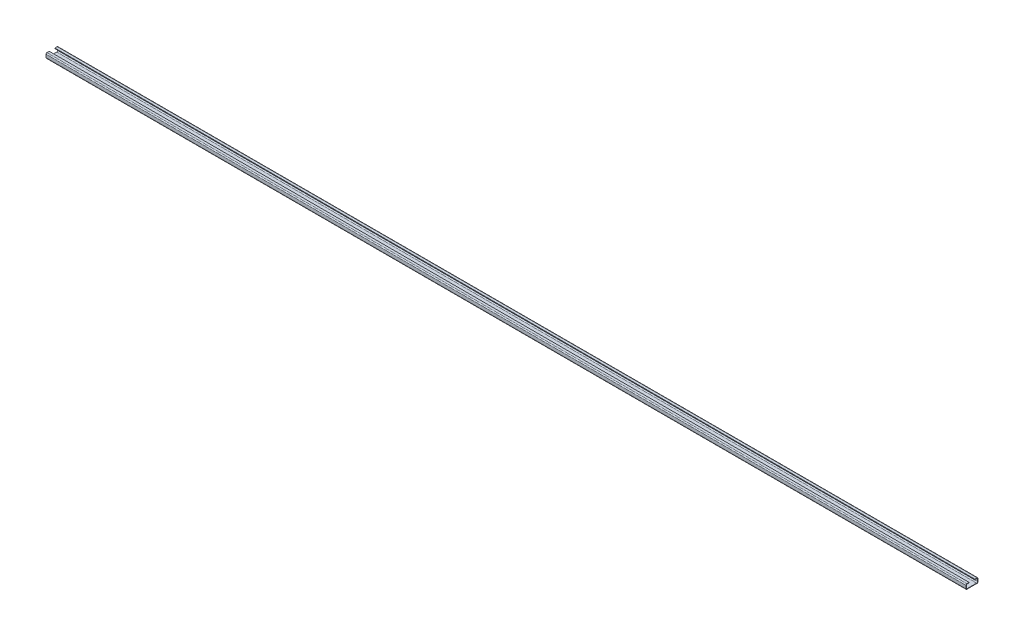
ISO-10303-21;
HEADER;
FILE_DESCRIPTION(('STEP AP214'),'2;1');
FILE_NAME('part.step','',(''),(''),'','','');
FILE_SCHEMA(('AUTOMOTIVE_DESIGN { 1 0 10303 214 1 1 1 1 }'));
ENDSEC;
DATA;
#1=APPLICATION_CONTEXT('core data for automotive mechanical design processes');
#2=APPLICATION_PROTOCOL_DEFINITION('international standard','automotive_design',2000,#1);
#3=PRODUCT_CONTEXT('',#1,'mechanical');
#4=PRODUCT('Part','Part','',(#3));
#5=PRODUCT_RELATED_PRODUCT_CATEGORY('part','',(#4));
#6=PRODUCT_DEFINITION_FORMATION('','',#4);
#7=PRODUCT_DEFINITION_CONTEXT('part definition',#1,'design');
#8=PRODUCT_DEFINITION('design','',#6,#7);
#9=PRODUCT_DEFINITION_SHAPE('','',#8);
#10=(LENGTH_UNIT() NAMED_UNIT(*) SI_UNIT(.MILLI.,.METRE.));
#11=(NAMED_UNIT(*) PLANE_ANGLE_UNIT() SI_UNIT($,.RADIAN.));
#12=(NAMED_UNIT(*) SI_UNIT($,.STERADIAN.) SOLID_ANGLE_UNIT());
#13=UNCERTAINTY_MEASURE_WITH_UNIT(LENGTH_MEASURE(1.E-05),#10,'distance_accuracy_value','');
#14=(GEOMETRIC_REPRESENTATION_CONTEXT(3) GLOBAL_UNCERTAINTY_ASSIGNED_CONTEXT((#13)) GLOBAL_UNIT_ASSIGNED_CONTEXT((#10,
#11,#12)) REPRESENTATION_CONTEXT('',''));
#15=CARTESIAN_POINT('',(0.,0.,0.));
#16=DIRECTION('',(0.,0.,1.));
#17=DIRECTION('',(1.,0.,0.));
#18=AXIS2_PLACEMENT_3D('',#15,#16,#17);
#19=CARTESIAN_POINT('',(5700.,15.,-37.5));
#20=DIRECTION('',(0.,0.,1.));
#21=DIRECTION('',(1.,0.,0.));
#22=AXIS2_PLACEMENT_3D('',#19,#20,#21);
#23=PLANE('',#22);
#24=DIRECTION('',(0.,1.,0.));
#25=VECTOR('',#24,1.);
#26=CARTESIAN_POINT('',(0.,15.,-37.5));
#27=LINE('',#26,#25);
#28=CARTESIAN_POINT('',(0.,-9.,-37.5));
#29=VERTEX_POINT('',#28);
#30=CARTESIAN_POINT('',(0.,9.,-37.5));
#31=VERTEX_POINT('',#30);
#32=EDGE_CURVE('E227',#29,#31,#27,.T.);
#33=ORIENTED_EDGE('',*,*,#32,.T.);
#34=DIRECTION('',(-1.,0.,0.));
#35=VECTOR('',#34,1.);
#36=CARTESIAN_POINT('',(5700.,9.,-37.5));
#37=LINE('',#36,#35);
#38=CARTESIAN_POINT('',(5700.,9.,-37.5));
#39=VERTEX_POINT('',#38);
#40=EDGE_CURVE('E303',#31,#39,#37,.F.);
#41=ORIENTED_EDGE('',*,*,#40,.T.);
#42=DIRECTION('',(0.,1.,0.));
#43=VECTOR('',#42,1.);
#44=CARTESIAN_POINT('',(5700.,15.,-37.5));
#45=LINE('',#44,#43);
#46=CARTESIAN_POINT('',(5700.,-9.,-37.5));
#47=VERTEX_POINT('',#46);
#48=EDGE_CURVE('E187',#47,#39,#45,.T.);
#49=ORIENTED_EDGE('',*,*,#48,.F.);
#50=DIRECTION('',(-1.,0.,0.));
#51=VECTOR('',#50,1.);
#52=CARTESIAN_POINT('',(5700.,-9.,-37.5));
#53=LINE('',#52,#51);
#54=EDGE_CURVE('E300',#47,#29,#53,.T.);
#55=ORIENTED_EDGE('',*,*,#54,.T.);
#56=EDGE_LOOP('',(#33,#41,#49,#55));
#57=FACE_BOUND('',#56,.T.);
#58=ADVANCED_FACE('F37',(#57),#23,.F.);
#59=CARTESIAN_POINT('',(5700.,15.,-17.5));
#60=DIRECTION('',(0.,-1.,0.));
#61=DIRECTION('',(0.,0.,-1.));
#62=AXIS2_PLACEMENT_3D('',#59,#60,#61);
#63=PLANE('',#62);
#64=DIRECTION('',(0.,0.,1.));
#65=VECTOR('',#64,1.);
#66=CARTESIAN_POINT('',(5700.,15.,-17.5));
#67=LINE('',#66,#65);
#68=CARTESIAN_POINT('',(5700.,15.,-31.5));
#69=VERTEX_POINT('',#68);
#70=CARTESIAN_POINT('',(5700.,15.,-17.5));
#71=VERTEX_POINT('',#70);
#72=EDGE_CURVE('E173',#69,#71,#67,.T.);
#73=ORIENTED_EDGE('',*,*,#72,.F.);
#74=DIRECTION('',(-1.,0.,0.));
#75=VECTOR('',#74,1.);
#76=CARTESIAN_POINT('',(5700.,15.,-31.5));
#77=LINE('',#76,#75);
#78=CARTESIAN_POINT('',(0.,15.,-31.5));
#79=VERTEX_POINT('',#78);
#80=EDGE_CURVE('E298',#69,#79,#77,.T.);
#81=ORIENTED_EDGE('',*,*,#80,.T.);
#82=DIRECTION('',(0.,0.,1.));
#83=VECTOR('',#82,1.);
#84=CARTESIAN_POINT('',(0.,15.,-17.5));
#85=LINE('',#84,#83);
#86=CARTESIAN_POINT('',(0.,15.,-17.5));
#87=VERTEX_POINT('',#86);
#88=EDGE_CURVE('E193',#79,#87,#85,.T.);
#89=ORIENTED_EDGE('',*,*,#88,.T.);
#90=DIRECTION('',(-1.,0.,0.));
#91=VECTOR('',#90,1.);
#92=CARTESIAN_POINT('',(5700.,15.,-17.5));
#93=LINE('',#92,#91);
#94=EDGE_CURVE('E190',#71,#87,#93,.T.);
#95=ORIENTED_EDGE('',*,*,#94,.F.);
#96=EDGE_LOOP('',(#73,#81,#89,#95));
#97=FACE_BOUND('',#96,.T.);
#98=ADVANCED_FACE('F191',(#97),#63,.F.);
#99=CARTESIAN_POINT('',(5700.,15.,-17.5));
#100=DIRECTION('',(0.,0.,-1.));
#101=DIRECTION('',(0.,1.,0.));
#102=AXIS2_PLACEMENT_3D('',#99,#100,#101);
#103=PLANE('',#102);
#104=DIRECTION('',(0.,-1.,0.));
#105=VECTOR('',#104,1.);
#106=CARTESIAN_POINT('',(0.,15.,-17.5));
#107=LINE('',#106,#105);
#108=CARTESIAN_POINT('',(0.,12.25,-17.5));
#109=VERTEX_POINT('',#108);
#110=EDGE_CURVE('E231',#87,#109,#107,.T.);
#111=ORIENTED_EDGE('',*,*,#110,.T.);
#112=DIRECTION('',(-1.,0.,0.));
#113=VECTOR('',#112,1.);
#114=CARTESIAN_POINT('',(5700.,12.25,-17.5));
#115=LINE('',#114,#113);
#116=CARTESIAN_POINT('',(5700.,12.25,-17.5));
#117=VERTEX_POINT('',#116);
#118=EDGE_CURVE('E197',#117,#109,#115,.T.);
#119=ORIENTED_EDGE('',*,*,#118,.F.);
#120=DIRECTION('',(0.,-1.,0.));
#121=VECTOR('',#120,1.);
#122=CARTESIAN_POINT('',(5700.,15.,-17.5));
#123=LINE('',#122,#121);
#124=EDGE_CURVE('E179',#71,#117,#123,.T.);
#125=ORIENTED_EDGE('',*,*,#124,.F.);
#126=ORIENTED_EDGE('',*,*,#94,.T.);
#127=EDGE_LOOP('',(#111,#119,#125,#126));
#128=FACE_BOUND('',#127,.T.);
#129=ADVANCED_FACE('F199',(#128),#103,.F.);
#130=CARTESIAN_POINT('',(5700.,12.25,-17.5));
#131=DIRECTION('',(0.,1.,0.));
#132=DIRECTION('',(0.,0.,1.));
#133=AXIS2_PLACEMENT_3D('',#130,#131,#132);
#134=PLANE('',#133);
#135=DIRECTION('',(0.,0.,-1.));
#136=VECTOR('',#135,1.);
#137=CARTESIAN_POINT('',(0.,12.25,-17.5));
#138=LINE('',#137,#136);
#139=CARTESIAN_POINT('',(0.,12.25,-28.75));
#140=VERTEX_POINT('',#139);
#141=EDGE_CURVE('E233',#109,#140,#138,.T.);
#142=ORIENTED_EDGE('',*,*,#141,.T.);
#143=DIRECTION('',(-1.,0.,0.));
#144=VECTOR('',#143,1.);
#145=CARTESIAN_POINT('',(5700.,12.25,-28.75));
#146=LINE('',#145,#144);
#147=CARTESIAN_POINT('',(5700.,12.25,-28.75));
#148=VERTEX_POINT('',#147);
#149=EDGE_CURVE('E267',#140,#148,#146,.F.);
#150=ORIENTED_EDGE('',*,*,#149,.T.);
#151=DIRECTION('',(0.,0.,-1.));
#152=VECTOR('',#151,1.);
#153=CARTESIAN_POINT('',(5700.,12.25,-17.5));
#154=LINE('',#153,#152);
#155=EDGE_CURVE('E202',#117,#148,#154,.T.);
#156=ORIENTED_EDGE('',*,*,#155,.F.);
#157=ORIENTED_EDGE('',*,*,#118,.T.);
#158=EDGE_LOOP('',(#142,#150,#156,#157));
#159=FACE_BOUND('',#158,.T.);
#160=ADVANCED_FACE('F462',(#159),#134,.F.);
#161=CARTESIAN_POINT('',(5700.,12.25,-34.75));
#162=DIRECTION('',(0.,0.,-1.));
#163=DIRECTION('',(0.,1.,0.));
#164=AXIS2_PLACEMENT_3D('',#161,#162,#163);
#165=PLANE('',#164);
#166=DIRECTION('',(0.,-1.,0.));
#167=VECTOR('',#166,1.);
#168=CARTESIAN_POINT('',(5700.,12.25,-34.75));
#169=LINE('',#168,#167);
#170=CARTESIAN_POINT('',(5700.,6.25,-34.75));
#171=VERTEX_POINT('',#170);
#172=CARTESIAN_POINT('',(5700.,-6.25,-34.75));
#173=VERTEX_POINT('',#172);
#174=EDGE_CURVE('E204',#171,#173,#169,.T.);
#175=ORIENTED_EDGE('',*,*,#174,.F.);
#176=DIRECTION('',(-1.,0.,0.));
#177=VECTOR('',#176,1.);
#178=CARTESIAN_POINT('',(0.,6.25,-34.75));
#179=LINE('',#178,#177);
#180=CARTESIAN_POINT('',(0.,6.25,-34.75));
#181=VERTEX_POINT('',#180);
#182=EDGE_CURVE('E264',#171,#181,#179,.T.);
#183=ORIENTED_EDGE('',*,*,#182,.T.);
#184=DIRECTION('',(0.,-1.,0.));
#185=VECTOR('',#184,1.);
#186=CARTESIAN_POINT('',(0.,12.25,-34.75));
#187=LINE('',#186,#185);
#188=CARTESIAN_POINT('',(0.,-6.25,-34.75));
#189=VERTEX_POINT('',#188);
#190=EDGE_CURVE('E236',#181,#189,#187,.T.);
#191=ORIENTED_EDGE('',*,*,#190,.T.);
#192=DIRECTION('',(-1.,0.,0.));
#193=VECTOR('',#192,1.);
#194=CARTESIAN_POINT('',(5700.,-6.25,-34.75));
#195=LINE('',#194,#193);
#196=EDGE_CURVE('E196',#189,#173,#195,.F.);
#197=ORIENTED_EDGE('',*,*,#196,.T.);
#198=EDGE_LOOP('',(#175,#183,#191,#197));
#199=FACE_BOUND('',#198,.T.);
#200=ADVANCED_FACE('F457',(#199),#165,.F.);
#201=CARTESIAN_POINT('',(5700.,-12.25,34.75));
#202=DIRECTION('',(0.,-1.,0.));
#203=DIRECTION('',(0.,0.,-1.));
#204=AXIS2_PLACEMENT_3D('',#201,#202,#203);
#205=PLANE('',#204);
#206=DIRECTION('',(0.,0.,1.));
#207=VECTOR('',#206,1.);
#208=CARTESIAN_POINT('',(5700.,-12.25,34.75));
#209=LINE('',#208,#207);
#210=CARTESIAN_POINT('',(5700.,-12.25,-28.75));
#211=VERTEX_POINT('',#210);
#212=CARTESIAN_POINT('',(5700.,-12.25,28.75));
#213=VERTEX_POINT('',#212);
#214=EDGE_CURVE('E210',#211,#213,#209,.T.);
#215=ORIENTED_EDGE('',*,*,#214,.F.);
#216=DIRECTION('',(-1.,0.,0.));
#217=VECTOR('',#216,1.);
#218=CARTESIAN_POINT('',(0.,-12.25,-28.75));
#219=LINE('',#218,#217);
#220=CARTESIAN_POINT('',(0.,-12.25,-28.75));
#221=VERTEX_POINT('',#220);
#222=EDGE_CURVE('E311',#211,#221,#219,.T.);
#223=ORIENTED_EDGE('',*,*,#222,.T.);
#224=DIRECTION('',(0.,0.,1.));
#225=VECTOR('',#224,1.);
#226=CARTESIAN_POINT('',(0.,-12.25,34.75));
#227=LINE('',#226,#225);
#228=CARTESIAN_POINT('',(0.,-12.25,28.75));
#229=VERTEX_POINT('',#228);
#230=EDGE_CURVE('E239',#221,#229,#227,.T.);
#231=ORIENTED_EDGE('',*,*,#230,.T.);
#232=DIRECTION('',(-1.,0.,0.));
#233=VECTOR('',#232,1.);
#234=CARTESIAN_POINT('',(5700.,-12.25,28.75));
#235=LINE('',#234,#233);
#236=EDGE_CURVE('E309',#229,#213,#235,.F.);
#237=ORIENTED_EDGE('',*,*,#236,.T.);
#238=EDGE_LOOP('',(#215,#223,#231,#237));
#239=FACE_BOUND('',#238,.T.);
#240=ADVANCED_FACE('F335',(#239),#205,.F.);
#241=CARTESIAN_POINT('',(5700.,12.25,34.75));
#242=DIRECTION('',(0.,0.,1.));
#243=DIRECTION('',(1.,0.,0.));
#244=AXIS2_PLACEMENT_3D('',#241,#242,#243);
#245=PLANE('',#244);
#246=DIRECTION('',(0.,1.,0.));
#247=VECTOR('',#246,1.);
#248=CARTESIAN_POINT('',(0.,12.25,34.75));
#249=LINE('',#248,#247);
#250=CARTESIAN_POINT('',(0.,-6.25,34.75));
#251=VERTEX_POINT('',#250);
#252=CARTESIAN_POINT('',(0.,6.25,34.75));
#253=VERTEX_POINT('',#252);
#254=EDGE_CURVE('E242',#251,#253,#249,.T.);
#255=ORIENTED_EDGE('',*,*,#254,.T.);
#256=DIRECTION('',(-1.,0.,0.));
#257=VECTOR('',#256,1.);
#258=CARTESIAN_POINT('',(5700.,6.25,34.75));
#259=LINE('',#258,#257);
#260=CARTESIAN_POINT('',(5700.,6.25,34.75));
#261=VERTEX_POINT('',#260);
#262=EDGE_CURVE('E275',#253,#261,#259,.F.);
#263=ORIENTED_EDGE('',*,*,#262,.T.);
#264=DIRECTION('',(0.,1.,0.));
#265=VECTOR('',#264,1.);
#266=CARTESIAN_POINT('',(5700.,12.25,34.75));
#267=LINE('',#266,#265);
#268=CARTESIAN_POINT('',(5700.,-6.25,34.75));
#269=VERTEX_POINT('',#268);
#270=EDGE_CURVE('E213',#269,#261,#267,.T.);
#271=ORIENTED_EDGE('',*,*,#270,.F.);
#272=DIRECTION('',(-1.,0.,0.));
#273=VECTOR('',#272,1.);
#274=CARTESIAN_POINT('',(0.,-6.25,34.75));
#275=LINE('',#274,#273);
#276=EDGE_CURVE('E272',#269,#251,#275,.T.);
#277=ORIENTED_EDGE('',*,*,#276,.T.);
#278=EDGE_LOOP('',(#255,#263,#271,#277));
#279=FACE_BOUND('',#278,.T.);
#280=ADVANCED_FACE('F342',(#279),#245,.F.);
#281=CARTESIAN_POINT('',(5700.,12.25,34.75));
#282=DIRECTION('',(0.,1.,0.));
#283=DIRECTION('',(0.,0.,1.));
#284=AXIS2_PLACEMENT_3D('',#281,#282,#283);
#285=PLANE('',#284);
#286=DIRECTION('',(0.,0.,-1.));
#287=VECTOR('',#286,1.);
#288=CARTESIAN_POINT('',(5700.,12.25,34.75));
#289=LINE('',#288,#287);
#290=CARTESIAN_POINT('',(5700.,12.25,28.75));
#291=VERTEX_POINT('',#290);
#292=CARTESIAN_POINT('',(5700.,12.25,17.5));
#293=VERTEX_POINT('',#292);
#294=EDGE_CURVE('E216',#291,#293,#289,.T.);
#295=ORIENTED_EDGE('',*,*,#294,.F.);
#296=DIRECTION('',(-1.,0.,0.));
#297=VECTOR('',#296,1.);
#298=CARTESIAN_POINT('',(0.,12.25,28.75));
#299=LINE('',#298,#297);
#300=CARTESIAN_POINT('',(0.,12.25,28.75));
#301=VERTEX_POINT('',#300);
#302=EDGE_CURVE('E269',#291,#301,#299,.T.);
#303=ORIENTED_EDGE('',*,*,#302,.T.);
#304=DIRECTION('',(0.,0.,-1.));
#305=VECTOR('',#304,1.);
#306=CARTESIAN_POINT('',(0.,12.25,34.75));
#307=LINE('',#306,#305);
#308=CARTESIAN_POINT('',(0.,12.25,17.5));
#309=VERTEX_POINT('',#308);
#310=EDGE_CURVE('E245',#301,#309,#307,.T.);
#311=ORIENTED_EDGE('',*,*,#310,.T.);
#312=DIRECTION('',(-1.,0.,0.));
#313=VECTOR('',#312,1.);
#314=CARTESIAN_POINT('',(5700.,12.25,17.5));
#315=LINE('',#314,#313);
#316=EDGE_CURVE('E259',#293,#309,#315,.T.);
#317=ORIENTED_EDGE('',*,*,#316,.F.);
#318=EDGE_LOOP('',(#295,#303,#311,#317));
#319=FACE_BOUND('',#318,.T.);
#320=ADVANCED_FACE('F350',(#319),#285,.F.);
#321=CARTESIAN_POINT('',(5700.,15.,17.5));
#322=DIRECTION('',(0.,0.,1.));
#323=DIRECTION('',(1.,0.,0.));
#324=AXIS2_PLACEMENT_3D('',#321,#322,#323);
#325=PLANE('',#324);
#326=DIRECTION('',(0.,1.,0.));
#327=VECTOR('',#326,1.);
#328=CARTESIAN_POINT('',(0.,15.,17.5));
#329=LINE('',#328,#327);
#330=CARTESIAN_POINT('',(0.,15.,17.5));
#331=VERTEX_POINT('',#330);
#332=EDGE_CURVE('E247',#309,#331,#329,.T.);
#333=ORIENTED_EDGE('',*,*,#332,.T.);
#334=DIRECTION('',(-1.,0.,0.));
#335=VECTOR('',#334,1.);
#336=CARTESIAN_POINT('',(5700.,15.,17.5));
#337=LINE('',#336,#335);
#338=CARTESIAN_POINT('',(5700.,15.,17.5));
#339=VERTEX_POINT('',#338);
#340=EDGE_CURVE('E226',#339,#331,#337,.T.);
#341=ORIENTED_EDGE('',*,*,#340,.F.);
#342=DIRECTION('',(0.,1.,0.));
#343=VECTOR('',#342,1.);
#344=CARTESIAN_POINT('',(5700.,15.,17.5));
#345=LINE('',#344,#343);
#346=EDGE_CURVE('E218',#293,#339,#345,.T.);
#347=ORIENTED_EDGE('',*,*,#346,.F.);
#348=ORIENTED_EDGE('',*,*,#316,.T.);
#349=EDGE_LOOP('',(#333,#341,#347,#348));
#350=FACE_BOUND('',#349,.T.);
#351=ADVANCED_FACE('F356',(#350),#325,.F.);
#352=CARTESIAN_POINT('',(5700.,15.,37.5));
#353=DIRECTION('',(0.,-1.,0.));
#354=DIRECTION('',(0.,0.,-1.));
#355=AXIS2_PLACEMENT_3D('',#352,#353,#354);
#356=PLANE('',#355);
#357=DIRECTION('',(0.,0.,1.));
#358=VECTOR('',#357,1.);
#359=CARTESIAN_POINT('',(0.,15.,37.5));
#360=LINE('',#359,#358);
#361=CARTESIAN_POINT('',(0.,15.,31.5));
#362=VERTEX_POINT('',#361);
#363=EDGE_CURVE('E249',#331,#362,#360,.T.);
#364=ORIENTED_EDGE('',*,*,#363,.T.);
#365=DIRECTION('',(-1.,0.,0.));
#366=VECTOR('',#365,1.);
#367=CARTESIAN_POINT('',(5700.,15.,31.5));
#368=LINE('',#367,#366);
#369=CARTESIAN_POINT('',(5700.,15.,31.5));
#370=VERTEX_POINT('',#369);
#371=EDGE_CURVE('E290',#362,#370,#368,.F.);
#372=ORIENTED_EDGE('',*,*,#371,.T.);
#373=DIRECTION('',(0.,0.,1.));
#374=VECTOR('',#373,1.);
#375=CARTESIAN_POINT('',(5700.,15.,37.5));
#376=LINE('',#375,#374);
#377=EDGE_CURVE('E220',#339,#370,#376,.T.);
#378=ORIENTED_EDGE('',*,*,#377,.F.);
#379=ORIENTED_EDGE('',*,*,#340,.T.);
#380=EDGE_LOOP('',(#364,#372,#378,#379));
#381=FACE_BOUND('',#380,.T.);
#382=ADVANCED_FACE('F479',(#381),#356,.F.);
#383=CARTESIAN_POINT('',(5700.,15.,37.5));
#384=DIRECTION('',(0.,0.,-1.));
#385=DIRECTION('',(0.,1.,0.));
#386=AXIS2_PLACEMENT_3D('',#383,#384,#385);
#387=PLANE('',#386);
#388=DIRECTION('',(0.,-1.,0.));
#389=VECTOR('',#388,1.);
#390=CARTESIAN_POINT('',(5700.,15.,37.5));
#391=LINE('',#390,#389);
#392=CARTESIAN_POINT('',(5700.,9.,37.5));
#393=VERTEX_POINT('',#392);
#394=CARTESIAN_POINT('',(5700.,-9.,37.5));
#395=VERTEX_POINT('',#394);
#396=EDGE_CURVE('E222',#393,#395,#391,.T.);
#397=ORIENTED_EDGE('',*,*,#396,.F.);
#398=DIRECTION('',(-1.,0.,0.));
#399=VECTOR('',#398,1.);
#400=CARTESIAN_POINT('',(5700.,9.,37.5));
#401=LINE('',#400,#399);
#402=CARTESIAN_POINT('',(0.,9.,37.5));
#403=VERTEX_POINT('',#402);
#404=EDGE_CURVE('E279',#393,#403,#401,.T.);
#405=ORIENTED_EDGE('',*,*,#404,.T.);
#406=DIRECTION('',(0.,-1.,0.));
#407=VECTOR('',#406,1.);
#408=CARTESIAN_POINT('',(0.,15.,37.5));
#409=LINE('',#408,#407);
#410=CARTESIAN_POINT('',(0.,-9.,37.5));
#411=VERTEX_POINT('',#410);
#412=EDGE_CURVE('E252',#403,#411,#409,.T.);
#413=ORIENTED_EDGE('',*,*,#412,.T.);
#414=DIRECTION('',(-1.,0.,0.));
#415=VECTOR('',#414,1.);
#416=CARTESIAN_POINT('',(5700.,-9.,37.5));
#417=LINE('',#416,#415);
#418=EDGE_CURVE('E277',#411,#395,#417,.F.);
#419=ORIENTED_EDGE('',*,*,#418,.T.);
#420=EDGE_LOOP('',(#397,#405,#413,#419));
#421=FACE_BOUND('',#420,.T.);
#422=ADVANCED_FACE('F366',(#421),#387,.F.);
#423=CARTESIAN_POINT('',(5700.,-15.,37.5));
#424=DIRECTION('',(0.,1.,0.));
#425=DIRECTION('',(0.,0.,1.));
#426=AXIS2_PLACEMENT_3D('',#423,#424,#425);
#427=PLANE('',#426);
#428=DIRECTION('',(0.,0.,-1.));
#429=VECTOR('',#428,1.);
#430=CARTESIAN_POINT('',(0.,-15.,37.5));
#431=LINE('',#430,#429);
#432=CARTESIAN_POINT('',(0.,-15.,31.5));
#433=VERTEX_POINT('',#432);
#434=CARTESIAN_POINT('',(0.,-15.,-31.5));
#435=VERTEX_POINT('',#434);
#436=EDGE_CURVE('E255',#433,#435,#431,.T.);
#437=ORIENTED_EDGE('',*,*,#436,.T.);
#438=DIRECTION('',(-1.,0.,0.));
#439=VECTOR('',#438,1.);
#440=CARTESIAN_POINT('',(5700.,-15.,-31.5));
#441=LINE('',#440,#439);
#442=CARTESIAN_POINT('',(5700.,-15.,-31.5));
#443=VERTEX_POINT('',#442);
#444=EDGE_CURVE('E52',#435,#443,#441,.F.);
#445=ORIENTED_EDGE('',*,*,#444,.T.);
#446=DIRECTION('',(0.,0.,-1.));
#447=VECTOR('',#446,1.);
#448=CARTESIAN_POINT('',(5700.,-15.,37.5));
#449=LINE('',#448,#447);
#450=CARTESIAN_POINT('',(5700.,-15.,31.5));
#451=VERTEX_POINT('',#450);
#452=EDGE_CURVE('E224',#451,#443,#449,.T.);
#453=ORIENTED_EDGE('',*,*,#452,.F.);
#454=DIRECTION('',(-1.,0.,0.));
#455=VECTOR('',#454,1.);
#456=CARTESIAN_POINT('',(5700.,-15.,31.5));
#457=LINE('',#456,#455);
#458=EDGE_CURVE('E305',#451,#433,#457,.T.);
#459=ORIENTED_EDGE('',*,*,#458,.T.);
#460=EDGE_LOOP('',(#437,#445,#453,#459));
#461=FACE_BOUND('',#460,.T.);
#462=ADVANCED_FACE('F372',(#461),#427,.F.);
#463=CARTESIAN_POINT('',(5700.,0.,0.));
#464=DIRECTION('',(1.,0.,0.));
#465=DIRECTION('',(0.,0.,-1.));
#466=AXIS2_PLACEMENT_3D('',#463,#464,#465);
#467=PLANE('',#466);
#468=ORIENTED_EDGE('',*,*,#377,.T.);
#469=CARTESIAN_POINT('',(5700.,9.,31.5));
#470=DIRECTION('',(1.,0.,0.));
#471=DIRECTION('',(0.,0.,-1.));
#472=AXIS2_PLACEMENT_3D('',#469,#470,#471);
#473=CIRCLE('',#472,6.);
#474=EDGE_CURVE('E296',#370,#393,#473,.T.);
#475=ORIENTED_EDGE('',*,*,#474,.T.);
#476=ORIENTED_EDGE('',*,*,#396,.T.);
#477=CARTESIAN_POINT('',(5700.,-9.,31.5));
#478=DIRECTION('',(1.,0.,0.));
#479=DIRECTION('',(0.,0.,-1.));
#480=AXIS2_PLACEMENT_3D('',#477,#478,#479);
#481=CIRCLE('',#480,6.);
#482=EDGE_CURVE('E59',#395,#451,#481,.T.);
#483=ORIENTED_EDGE('',*,*,#482,.T.);
#484=ORIENTED_EDGE('',*,*,#452,.T.);
#485=CARTESIAN_POINT('',(5700.,-9.,-31.5));
#486=DIRECTION('',(1.,0.,0.));
#487=DIRECTION('',(0.,0.,-1.));
#488=AXIS2_PLACEMENT_3D('',#485,#486,#487);
#489=CIRCLE('',#488,6.);
#490=EDGE_CURVE('E293',#443,#47,#489,.T.);
#491=ORIENTED_EDGE('',*,*,#490,.T.);
#492=ORIENTED_EDGE('',*,*,#48,.T.);
#493=CARTESIAN_POINT('',(5700.,9.,-31.5));
#494=DIRECTION('',(1.,0.,0.));
#495=DIRECTION('',(0.,0.,-1.));
#496=AXIS2_PLACEMENT_3D('',#493,#494,#495);
#497=CIRCLE('',#496,6.);
#498=EDGE_CURVE('E183',#39,#69,#497,.T.);
#499=ORIENTED_EDGE('',*,*,#498,.T.);
#500=ORIENTED_EDGE('',*,*,#72,.T.);
#501=ORIENTED_EDGE('',*,*,#124,.T.);
#502=ORIENTED_EDGE('',*,*,#155,.T.);
#503=CARTESIAN_POINT('',(5700.,6.25,-28.75));
#504=DIRECTION('',(1.,0.,0.));
#505=DIRECTION('',(0.,0.,-1.));
#506=AXIS2_PLACEMENT_3D('',#503,#504,#505);
#507=CIRCLE('',#506,6.);
#508=EDGE_CURVE('E316',#148,#171,#507,.F.);
#509=ORIENTED_EDGE('',*,*,#508,.T.);
#510=ORIENTED_EDGE('',*,*,#174,.T.);
#511=CARTESIAN_POINT('',(5700.,-6.25,-28.75));
#512=DIRECTION('',(1.,0.,0.));
#513=DIRECTION('',(0.,0.,-1.));
#514=AXIS2_PLACEMENT_3D('',#511,#512,#513);
#515=CIRCLE('',#514,6.);
#516=EDGE_CURVE('E324',#173,#211,#515,.F.);
#517=ORIENTED_EDGE('',*,*,#516,.T.);
#518=ORIENTED_EDGE('',*,*,#214,.T.);
#519=CARTESIAN_POINT('',(5700.,-6.25,28.75));
#520=DIRECTION('',(1.,0.,0.));
#521=DIRECTION('',(0.,0.,-1.));
#522=AXIS2_PLACEMENT_3D('',#519,#520,#521);
#523=CIRCLE('',#522,6.);
#524=EDGE_CURVE('E11',#213,#269,#523,.F.);
#525=ORIENTED_EDGE('',*,*,#524,.T.);
#526=ORIENTED_EDGE('',*,*,#270,.T.);
#527=CARTESIAN_POINT('',(5700.,6.25,28.75));
#528=DIRECTION('',(1.,0.,0.));
#529=DIRECTION('',(0.,0.,-1.));
#530=AXIS2_PLACEMENT_3D('',#527,#528,#529);
#531=CIRCLE('',#530,6.);
#532=EDGE_CURVE('E320',#261,#291,#531,.F.);
#533=ORIENTED_EDGE('',*,*,#532,.T.);
#534=ORIENTED_EDGE('',*,*,#294,.T.);
#535=ORIENTED_EDGE('',*,*,#346,.T.);
#536=EDGE_LOOP('',(#468,#475,#476,#483,#484,#491,#492,#499,#500,#501,#502,#509,#510,#517,#518,
#525,#526,#533,#534,#535));
#537=FACE_BOUND('',#536,.T.);
#538=ADVANCED_FACE('F176',(#537),#467,.T.);
#539=CARTESIAN_POINT('',(0.,0.,0.));
#540=DIRECTION('',(1.,0.,0.));
#541=DIRECTION('',(0.,0.,-1.));
#542=AXIS2_PLACEMENT_3D('',#539,#540,#541);
#543=PLANE('',#542);
#544=ORIENTED_EDGE('',*,*,#412,.F.);
#545=CARTESIAN_POINT('',(0.,9.,31.5));
#546=DIRECTION('',(1.,0.,0.));
#547=DIRECTION('',(0.,0.,-1.));
#548=AXIS2_PLACEMENT_3D('',#545,#546,#547);
#549=CIRCLE('',#548,6.);
#550=EDGE_CURVE('E288',#403,#362,#549,.F.);
#551=ORIENTED_EDGE('',*,*,#550,.T.);
#552=ORIENTED_EDGE('',*,*,#363,.F.);
#553=ORIENTED_EDGE('',*,*,#332,.F.);
#554=ORIENTED_EDGE('',*,*,#310,.F.);
#555=CARTESIAN_POINT('',(0.,6.25,28.75));
#556=DIRECTION('',(1.,0.,0.));
#557=DIRECTION('',(0.,0.,-1.));
#558=AXIS2_PLACEMENT_3D('',#555,#556,#557);
#559=CIRCLE('',#558,6.);
#560=EDGE_CURVE('E318',#301,#253,#559,.T.);
#561=ORIENTED_EDGE('',*,*,#560,.T.);
#562=ORIENTED_EDGE('',*,*,#254,.F.);
#563=CARTESIAN_POINT('',(0.,-6.25,28.75));
#564=DIRECTION('',(1.,0.,0.));
#565=DIRECTION('',(0.,0.,-1.));
#566=AXIS2_PLACEMENT_3D('',#563,#564,#565);
#567=CIRCLE('',#566,6.);
#568=EDGE_CURVE('E45',#251,#229,#567,.T.);
#569=ORIENTED_EDGE('',*,*,#568,.T.);
#570=ORIENTED_EDGE('',*,*,#230,.F.);
#571=CARTESIAN_POINT('',(0.,-6.25,-28.75));
#572=DIRECTION('',(1.,0.,0.));
#573=DIRECTION('',(0.,0.,-1.));
#574=AXIS2_PLACEMENT_3D('',#571,#572,#573);
#575=CIRCLE('',#574,6.);
#576=EDGE_CURVE('E322',#221,#189,#575,.T.);
#577=ORIENTED_EDGE('',*,*,#576,.T.);
#578=ORIENTED_EDGE('',*,*,#190,.F.);
#579=CARTESIAN_POINT('',(0.,6.25,-28.75));
#580=DIRECTION('',(1.,0.,0.));
#581=DIRECTION('',(0.,0.,-1.));
#582=AXIS2_PLACEMENT_3D('',#579,#580,#581);
#583=CIRCLE('',#582,6.);
#584=EDGE_CURVE('E314',#181,#140,#583,.T.);
#585=ORIENTED_EDGE('',*,*,#584,.T.);
#586=ORIENTED_EDGE('',*,*,#141,.F.);
#587=ORIENTED_EDGE('',*,*,#110,.F.);
#588=ORIENTED_EDGE('',*,*,#88,.F.);
#589=CARTESIAN_POINT('',(0.,9.,-31.5));
#590=DIRECTION('',(1.,0.,0.));
#591=DIRECTION('',(0.,0.,-1.));
#592=AXIS2_PLACEMENT_3D('',#589,#590,#591);
#593=CIRCLE('',#592,6.);
#594=EDGE_CURVE('E286',#79,#31,#593,.F.);
#595=ORIENTED_EDGE('',*,*,#594,.T.);
#596=ORIENTED_EDGE('',*,*,#32,.F.);
#597=CARTESIAN_POINT('',(0.,-9.,-31.5));
#598=DIRECTION('',(1.,0.,0.));
#599=DIRECTION('',(0.,0.,-1.));
#600=AXIS2_PLACEMENT_3D('',#597,#598,#599);
#601=CIRCLE('',#600,6.);
#602=EDGE_CURVE('E284',#29,#435,#601,.F.);
#603=ORIENTED_EDGE('',*,*,#602,.T.);
#604=ORIENTED_EDGE('',*,*,#436,.F.);
#605=CARTESIAN_POINT('',(0.,-9.,31.5));
#606=DIRECTION('',(1.,0.,0.));
#607=DIRECTION('',(0.,0.,-1.));
#608=AXIS2_PLACEMENT_3D('',#605,#606,#607);
#609=CIRCLE('',#608,6.);
#610=EDGE_CURVE('E282',#433,#411,#609,.F.);
#611=ORIENTED_EDGE('',*,*,#610,.T.);
#612=EDGE_LOOP('',(#544,#551,#552,#553,#554,#561,#562,#569,#570,#577,#578,#585,#586,#587,#588,
#595,#596,#603,#604,#611));
#613=FACE_BOUND('',#612,.T.);
#614=ADVANCED_FACE('F329',(#613),#543,.F.);
#615=CARTESIAN_POINT('',(5700.,6.25,-28.75));
#616=DIRECTION('',(1.,0.,0.));
#617=DIRECTION('',(0.,0.,-1.));
#618=AXIS2_PLACEMENT_3D('',#615,#616,#617);
#619=CYLINDRICAL_SURFACE('',#618,6.);
#620=ORIENTED_EDGE('',*,*,#508,.F.);
#621=ORIENTED_EDGE('',*,*,#149,.F.);
#622=ORIENTED_EDGE('',*,*,#584,.F.);
#623=ORIENTED_EDGE('',*,*,#182,.F.);
#624=EDGE_LOOP('',(#620,#621,#622,#623));
#625=FACE_BOUND('',#624,.T.);
#626=ADVANCED_FACE('F400',(#625),#619,.F.);
#627=CARTESIAN_POINT('',(5700.,6.25,28.75));
#628=DIRECTION('',(1.,0.,0.));
#629=DIRECTION('',(0.,0.,-1.));
#630=AXIS2_PLACEMENT_3D('',#627,#628,#629);
#631=CYLINDRICAL_SURFACE('',#630,6.);
#632=ORIENTED_EDGE('',*,*,#532,.F.);
#633=ORIENTED_EDGE('',*,*,#262,.F.);
#634=ORIENTED_EDGE('',*,*,#560,.F.);
#635=ORIENTED_EDGE('',*,*,#302,.F.);
#636=EDGE_LOOP('',(#632,#633,#634,#635));
#637=FACE_BOUND('',#636,.T.);
#638=ADVANCED_FACE('F345',(#637),#631,.F.);
#639=CARTESIAN_POINT('',(5700.,9.,31.5));
#640=DIRECTION('',(-1.,0.,0.));
#641=DIRECTION('',(0.,0.,1.));
#642=AXIS2_PLACEMENT_3D('',#639,#640,#641);
#643=CYLINDRICAL_SURFACE('',#642,6.);
#644=ORIENTED_EDGE('',*,*,#474,.F.);
#645=ORIENTED_EDGE('',*,*,#371,.F.);
#646=ORIENTED_EDGE('',*,*,#550,.F.);
#647=ORIENTED_EDGE('',*,*,#404,.F.);
#648=EDGE_LOOP('',(#644,#645,#646,#647));
#649=FACE_BOUND('',#648,.T.);
#650=ADVANCED_FACE('F364',(#649),#643,.T.);
#651=CARTESIAN_POINT('',(5700.,9.,-31.5));
#652=DIRECTION('',(-1.,0.,0.));
#653=DIRECTION('',(0.,0.,1.));
#654=AXIS2_PLACEMENT_3D('',#651,#652,#653);
#655=CYLINDRICAL_SURFACE('',#654,6.);
#656=ORIENTED_EDGE('',*,*,#498,.F.);
#657=ORIENTED_EDGE('',*,*,#40,.F.);
#658=ORIENTED_EDGE('',*,*,#594,.F.);
#659=ORIENTED_EDGE('',*,*,#80,.F.);
#660=EDGE_LOOP('',(#656,#657,#658,#659));
#661=FACE_BOUND('',#660,.T.);
#662=ADVANCED_FACE('F382',(#661),#655,.T.);
#663=CARTESIAN_POINT('',(5700.,-9.,-31.5));
#664=DIRECTION('',(-1.,0.,0.));
#665=DIRECTION('',(0.,0.,1.));
#666=AXIS2_PLACEMENT_3D('',#663,#664,#665);
#667=CYLINDRICAL_SURFACE('',#666,6.);
#668=ORIENTED_EDGE('',*,*,#490,.F.);
#669=ORIENTED_EDGE('',*,*,#444,.F.);
#670=ORIENTED_EDGE('',*,*,#602,.F.);
#671=ORIENTED_EDGE('',*,*,#54,.F.);
#672=EDGE_LOOP('',(#668,#669,#670,#671));
#673=FACE_BOUND('',#672,.T.);
#674=ADVANCED_FACE('F377',(#673),#667,.T.);
#675=CARTESIAN_POINT('',(5700.,-6.25,-28.75));
#676=DIRECTION('',(1.,0.,0.));
#677=DIRECTION('',(0.,0.,-1.));
#678=AXIS2_PLACEMENT_3D('',#675,#676,#677);
#679=CYLINDRICAL_SURFACE('',#678,6.);
#680=ORIENTED_EDGE('',*,*,#516,.F.);
#681=ORIENTED_EDGE('',*,*,#196,.F.);
#682=ORIENTED_EDGE('',*,*,#576,.F.);
#683=ORIENTED_EDGE('',*,*,#222,.F.);
#684=EDGE_LOOP('',(#680,#681,#682,#683));
#685=FACE_BOUND('',#684,.T.);
#686=ADVANCED_FACE('F389',(#685),#679,.F.);
#687=CARTESIAN_POINT('',(5700.,-6.25,28.75));
#688=DIRECTION('',(1.,0.,0.));
#689=DIRECTION('',(0.,0.,-1.));
#690=AXIS2_PLACEMENT_3D('',#687,#688,#689);
#691=CYLINDRICAL_SURFACE('',#690,6.);
#692=ORIENTED_EDGE('',*,*,#524,.F.);
#693=ORIENTED_EDGE('',*,*,#236,.F.);
#694=ORIENTED_EDGE('',*,*,#568,.F.);
#695=ORIENTED_EDGE('',*,*,#276,.F.);
#696=EDGE_LOOP('',(#692,#693,#694,#695));
#697=FACE_BOUND('',#696,.T.);
#698=ADVANCED_FACE('F338',(#697),#691,.F.);
#699=CARTESIAN_POINT('',(5700.,-9.,31.5));
#700=DIRECTION('',(-1.,0.,0.));
#701=DIRECTION('',(0.,0.,1.));
#702=AXIS2_PLACEMENT_3D('',#699,#700,#701);
#703=CYLINDRICAL_SURFACE('',#702,6.);
#704=ORIENTED_EDGE('',*,*,#482,.F.);
#705=ORIENTED_EDGE('',*,*,#418,.F.);
#706=ORIENTED_EDGE('',*,*,#610,.F.);
#707=ORIENTED_EDGE('',*,*,#458,.F.);
#708=EDGE_LOOP('',(#704,#705,#706,#707));
#709=FACE_BOUND('',#708,.T.);
#710=ADVANCED_FACE('F39',(#709),#703,.T.);
#711=CLOSED_SHELL('',(#58,#98,#129,#160,#200,#240,#280,#320,#351,#382,#422,#462,#538,#614,#626,
#638,#650,#662,#674,#686,#698,#710));
#712=MANIFOLD_SOLID_BREP('B2',#711);
#713=ADVANCED_BREP_SHAPE_REPRESENTATION('',(#18,#712),#14);
#714=SHAPE_DEFINITION_REPRESENTATION(#9,#713);
ENDSEC;
END-ISO-10303-21;
